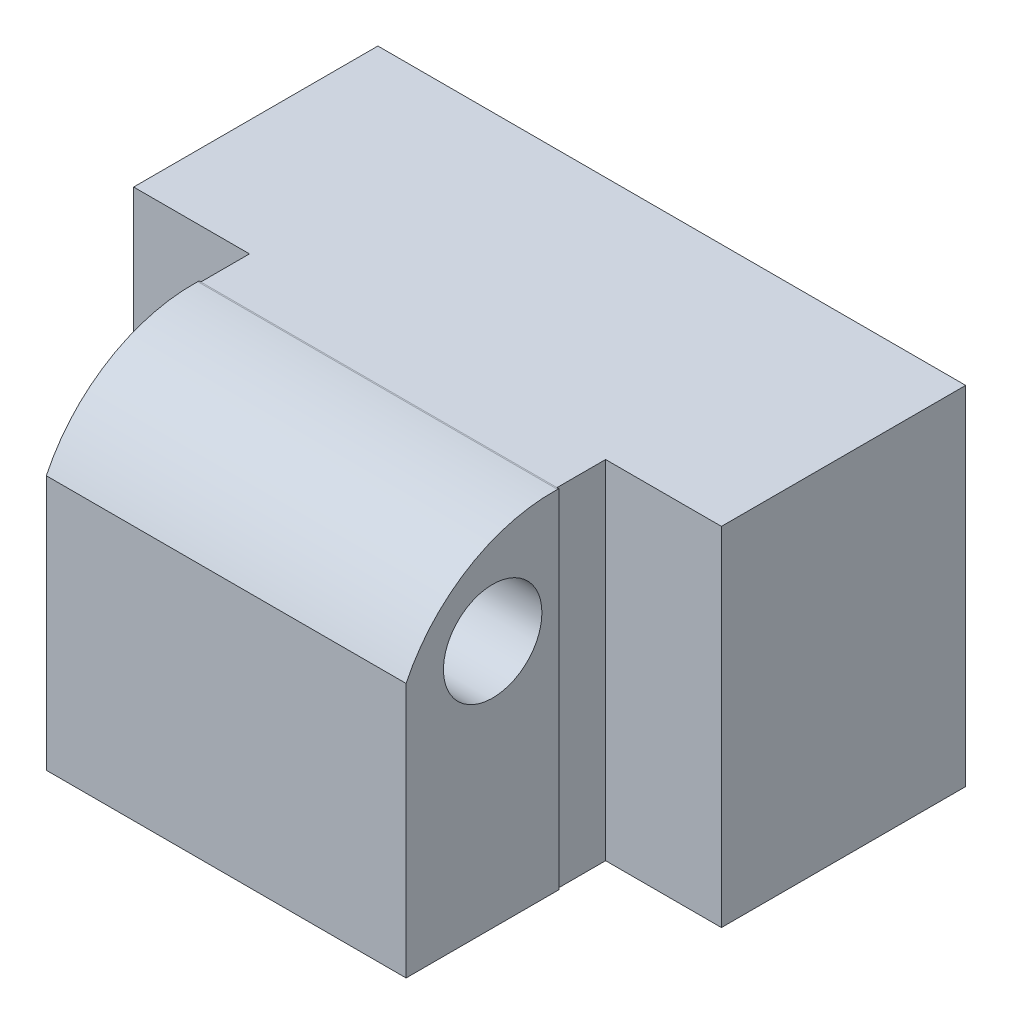
ISO-10303-21;
HEADER;
FILE_DESCRIPTION(('STEP AP214'),'2;1');
FILE_NAME('part.step','',(''),(''),'','','');
FILE_SCHEMA(('AUTOMOTIVE_DESIGN { 1 0 10303 214 1 1 1 1 }'));
ENDSEC;
DATA;
#1=APPLICATION_CONTEXT('core data for automotive mechanical design processes');
#2=APPLICATION_PROTOCOL_DEFINITION('international standard','automotive_design',2000,#1);
#3=PRODUCT_CONTEXT('',#1,'mechanical');
#4=PRODUCT('Part','Part','',(#3));
#5=PRODUCT_RELATED_PRODUCT_CATEGORY('part','',(#4));
#6=PRODUCT_DEFINITION_FORMATION('','',#4);
#7=PRODUCT_DEFINITION_CONTEXT('part definition',#1,'design');
#8=PRODUCT_DEFINITION('design','',#6,#7);
#9=PRODUCT_DEFINITION_SHAPE('','',#8);
#10=(LENGTH_UNIT() NAMED_UNIT(*) SI_UNIT(.MILLI.,.METRE.));
#11=(NAMED_UNIT(*) PLANE_ANGLE_UNIT() SI_UNIT($,.RADIAN.));
#12=(NAMED_UNIT(*) SI_UNIT($,.STERADIAN.) SOLID_ANGLE_UNIT());
#13=UNCERTAINTY_MEASURE_WITH_UNIT(LENGTH_MEASURE(1.E-05),#10,'distance_accuracy_value','');
#14=(GEOMETRIC_REPRESENTATION_CONTEXT(3) GLOBAL_UNCERTAINTY_ASSIGNED_CONTEXT((#13)) GLOBAL_UNIT_ASSIGNED_CONTEXT((#10,
#11,#12)) REPRESENTATION_CONTEXT('',''));
#15=CARTESIAN_POINT('',(0.,0.,0.));
#16=DIRECTION('',(0.,0.,1.));
#17=DIRECTION('',(1.,0.,0.));
#18=AXIS2_PLACEMENT_3D('',#15,#16,#17);
#19=CARTESIAN_POINT('',(-10.15,12.,65.2544271440087));
#20=DIRECTION('',(1.,0.,0.));
#21=DIRECTION('',(0.,0.,-1.));
#22=AXIS2_PLACEMENT_3D('',#19,#20,#21);
#23=PLANE('',#22);
#24=DIRECTION('',(0.,0.,1.));
#25=VECTOR('',#24,1.);
#26=CARTESIAN_POINT('',(-10.15,0.,65.2544271440087));
#27=LINE('',#26,#25);
#28=CARTESIAN_POINT('',(-10.15,0.,56.819346079043));
#29=VERTEX_POINT('',#28);
#30=CARTESIAN_POINT('',(-10.15,0.,65.2544271440087));
#31=VERTEX_POINT('',#30);
#32=EDGE_CURVE('E142',#29,#31,#27,.T.);
#33=ORIENTED_EDGE('',*,*,#32,.T.);
#34=DIRECTION('',(0.,-1.,0.));
#35=VECTOR('',#34,1.);
#36=CARTESIAN_POINT('',(-10.15,12.,65.2544271440087));
#37=LINE('',#36,#35);
#38=CARTESIAN_POINT('',(-10.15,12.,65.2544271440087));
#39=VERTEX_POINT('',#38);
#40=EDGE_CURVE('E11',#39,#31,#37,.T.);
#41=ORIENTED_EDGE('',*,*,#40,.F.);
#42=DIRECTION('',(0.,0.,1.));
#43=VECTOR('',#42,1.);
#44=CARTESIAN_POINT('',(-10.15,12.,65.2544271440087));
#45=LINE('',#44,#43);
#46=CARTESIAN_POINT('',(-10.15,12.,56.819346079043));
#47=VERTEX_POINT('',#46);
#48=EDGE_CURVE('E163',#47,#39,#45,.T.);
#49=ORIENTED_EDGE('',*,*,#48,.F.);
#50=DIRECTION('',(0.,-1.,0.));
#51=VECTOR('',#50,1.);
#52=CARTESIAN_POINT('',(-10.15,12.,56.819346079043));
#53=LINE('',#52,#51);
#54=EDGE_CURVE('E138',#47,#29,#53,.T.);
#55=ORIENTED_EDGE('',*,*,#54,.T.);
#56=EDGE_LOOP('',(#33,#41,#49,#55));
#57=FACE_BOUND('',#56,.T.);
#58=ADVANCED_FACE('F41',(#57),#23,.F.);
#59=CARTESIAN_POINT('',(-6.15,12.,65.2544271440087));
#60=DIRECTION('',(0.,0.,-1.));
#61=DIRECTION('',(-1.,0.,0.));
#62=AXIS2_PLACEMENT_3D('',#59,#60,#61);
#63=PLANE('',#62);
#64=DIRECTION('',(1.,0.,0.));
#65=VECTOR('',#64,1.);
#66=CARTESIAN_POINT('',(-6.15,0.,65.2544271440087));
#67=LINE('',#66,#65);
#68=CARTESIAN_POINT('',(-6.15,0.,65.2544271440087));
#69=VERTEX_POINT('',#68);
#70=EDGE_CURVE('E146',#31,#69,#67,.T.);
#71=ORIENTED_EDGE('',*,*,#70,.T.);
#72=DIRECTION('',(0.,-1.,0.));
#73=VECTOR('',#72,1.);
#74=CARTESIAN_POINT('',(-6.15,12.,65.2544271440087));
#75=LINE('',#74,#73);
#76=CARTESIAN_POINT('',(-6.15,12.,65.2544271440087));
#77=VERTEX_POINT('',#76);
#78=EDGE_CURVE('E50',#77,#69,#75,.T.);
#79=ORIENTED_EDGE('',*,*,#78,.F.);
#80=DIRECTION('',(1.,0.,0.));
#81=VECTOR('',#80,1.);
#82=CARTESIAN_POINT('',(-6.15,12.,65.2544271440087));
#83=LINE('',#82,#81);
#84=EDGE_CURVE('E99',#39,#77,#83,.T.);
#85=ORIENTED_EDGE('',*,*,#84,.F.);
#86=ORIENTED_EDGE('',*,*,#40,.T.);
#87=EDGE_LOOP('',(#71,#79,#85,#86));
#88=FACE_BOUND('',#87,.T.);
#89=ADVANCED_FACE('F341',(#88),#63,.F.);
#90=CARTESIAN_POINT('',(-6.15,12.,66.9344271440087));
#91=DIRECTION('',(1.,0.,0.));
#92=DIRECTION('',(0.,0.,-1.));
#93=AXIS2_PLACEMENT_3D('',#90,#91,#92);
#94=PLANE('',#93);
#95=DIRECTION('',(0.,0.,1.));
#96=VECTOR('',#95,1.);
#97=CARTESIAN_POINT('',(-6.15,0.,66.9344271440087));
#98=LINE('',#97,#96);
#99=CARTESIAN_POINT('',(-6.15,0.,66.9344271440087));
#100=VERTEX_POINT('',#99);
#101=EDGE_CURVE('E150',#69,#100,#98,.T.);
#102=ORIENTED_EDGE('',*,*,#101,.T.);
#103=DIRECTION('',(0.,-1.,0.));
#104=VECTOR('',#103,1.);
#105=CARTESIAN_POINT('',(-6.15,12.,66.9344271440087));
#106=LINE('',#105,#104);
#107=CARTESIAN_POINT('',(-6.15,12.,66.9344271440087));
#108=VERTEX_POINT('',#107);
#109=EDGE_CURVE('E173',#108,#100,#106,.T.);
#110=ORIENTED_EDGE('',*,*,#109,.F.);
#111=DIRECTION('',(0.,0.,1.));
#112=VECTOR('',#111,1.);
#113=CARTESIAN_POINT('',(-6.15,12.,66.9344271440087));
#114=LINE('',#113,#112);
#115=EDGE_CURVE('E183',#77,#108,#114,.T.);
#116=ORIENTED_EDGE('',*,*,#115,.F.);
#117=ORIENTED_EDGE('',*,*,#78,.T.);
#118=EDGE_LOOP('',(#102,#110,#116,#117));
#119=FACE_BOUND('',#118,.T.);
#120=ADVANCED_FACE('F181',(#119),#94,.F.);
#121=CARTESIAN_POINT('',(6.15000000000001,12.,65.2544271440087));
#122=DIRECTION('',(-1.,0.,0.));
#123=DIRECTION('',(0.,0.,1.));
#124=AXIS2_PLACEMENT_3D('',#121,#122,#123);
#125=PLANE('',#124);
#126=DIRECTION('',(0.,0.,-1.));
#127=VECTOR('',#126,1.);
#128=CARTESIAN_POINT('',(6.15000000000001,0.,65.2544271440087));
#129=LINE('',#128,#127);
#130=CARTESIAN_POINT('',(6.15000000000001,0.,66.9344271440087));
#131=VERTEX_POINT('',#130);
#132=CARTESIAN_POINT('',(6.15000000000001,0.,65.2544271440087));
#133=VERTEX_POINT('',#132);
#134=EDGE_CURVE('E154',#131,#133,#129,.T.);
#135=ORIENTED_EDGE('',*,*,#134,.T.);
#136=DIRECTION('',(0.,-1.,0.));
#137=VECTOR('',#136,1.);
#138=CARTESIAN_POINT('',(6.15000000000001,12.,65.2544271440087));
#139=LINE('',#138,#137);
#140=CARTESIAN_POINT('',(6.15000000000001,12.,65.2544271440087));
#141=VERTEX_POINT('',#140);
#142=EDGE_CURVE('E131',#141,#133,#139,.T.);
#143=ORIENTED_EDGE('',*,*,#142,.F.);
#144=DIRECTION('',(0.,0.,-1.));
#145=VECTOR('',#144,1.);
#146=CARTESIAN_POINT('',(6.15000000000001,12.,65.2544271440087));
#147=LINE('',#146,#145);
#148=CARTESIAN_POINT('',(6.15000000000001,12.,66.9344271440087));
#149=VERTEX_POINT('',#148);
#150=EDGE_CURVE('E120',#149,#141,#147,.T.);
#151=ORIENTED_EDGE('',*,*,#150,.F.);
#152=DIRECTION('',(0.,-1.,0.));
#153=VECTOR('',#152,1.);
#154=CARTESIAN_POINT('',(6.15000000000001,12.,66.9344271440087));
#155=LINE('',#154,#153);
#156=EDGE_CURVE('E170',#149,#131,#155,.T.);
#157=ORIENTED_EDGE('',*,*,#156,.T.);
#158=EDGE_LOOP('',(#135,#143,#151,#157));
#159=FACE_BOUND('',#158,.T.);
#160=ADVANCED_FACE('F227',(#159),#125,.F.);
#161=CARTESIAN_POINT('',(10.15,12.,65.2544271440087));
#162=DIRECTION('',(0.,0.,-1.));
#163=DIRECTION('',(-1.,0.,0.));
#164=AXIS2_PLACEMENT_3D('',#161,#162,#163);
#165=PLANE('',#164);
#166=DIRECTION('',(1.,0.,0.));
#167=VECTOR('',#166,1.);
#168=CARTESIAN_POINT('',(10.15,0.,65.2544271440087));
#169=LINE('',#168,#167);
#170=CARTESIAN_POINT('',(10.15,0.,65.2544271440087));
#171=VERTEX_POINT('',#170);
#172=EDGE_CURVE('E129',#133,#171,#169,.T.);
#173=ORIENTED_EDGE('',*,*,#172,.T.);
#174=DIRECTION('',(0.,-1.,0.));
#175=VECTOR('',#174,1.);
#176=CARTESIAN_POINT('',(10.15,12.,65.2544271440087));
#177=LINE('',#176,#175);
#178=CARTESIAN_POINT('',(10.15,12.,65.2544271440087));
#179=VERTEX_POINT('',#178);
#180=EDGE_CURVE('E126',#179,#171,#177,.T.);
#181=ORIENTED_EDGE('',*,*,#180,.F.);
#182=DIRECTION('',(1.,0.,0.));
#183=VECTOR('',#182,1.);
#184=CARTESIAN_POINT('',(10.15,12.,65.2544271440087));
#185=LINE('',#184,#183);
#186=EDGE_CURVE('E114',#141,#179,#185,.T.);
#187=ORIENTED_EDGE('',*,*,#186,.F.);
#188=ORIENTED_EDGE('',*,*,#142,.T.);
#189=EDGE_LOOP('',(#173,#181,#187,#188));
#190=FACE_BOUND('',#189,.T.);
#191=ADVANCED_FACE('F127',(#190),#165,.F.);
#192=CARTESIAN_POINT('',(10.15,12.,65.2544271440087));
#193=DIRECTION('',(-1.,0.,0.));
#194=DIRECTION('',(0.,0.,1.));
#195=AXIS2_PLACEMENT_3D('',#192,#193,#194);
#196=PLANE('',#195);
#197=DIRECTION('',(0.,0.,-1.));
#198=VECTOR('',#197,1.);
#199=CARTESIAN_POINT('',(10.15,0.,65.2544271440087));
#200=LINE('',#199,#198);
#201=CARTESIAN_POINT('',(10.15,0.,56.819346079043));
#202=VERTEX_POINT('',#201);
#203=EDGE_CURVE('E85',#171,#202,#200,.T.);
#204=ORIENTED_EDGE('',*,*,#203,.T.);
#205=DIRECTION('',(0.,-1.,0.));
#206=VECTOR('',#205,1.);
#207=CARTESIAN_POINT('',(10.15,12.,56.819346079043));
#208=LINE('',#207,#206);
#209=CARTESIAN_POINT('',(10.15,12.,56.819346079043));
#210=VERTEX_POINT('',#209);
#211=EDGE_CURVE('E132',#210,#202,#208,.T.);
#212=ORIENTED_EDGE('',*,*,#211,.F.);
#213=DIRECTION('',(0.,0.,-1.));
#214=VECTOR('',#213,1.);
#215=CARTESIAN_POINT('',(10.15,12.,65.2544271440087));
#216=LINE('',#215,#214);
#217=EDGE_CURVE('E118',#179,#210,#216,.T.);
#218=ORIENTED_EDGE('',*,*,#217,.F.);
#219=ORIENTED_EDGE('',*,*,#180,.T.);
#220=EDGE_LOOP('',(#204,#212,#218,#219));
#221=FACE_BOUND('',#220,.T.);
#222=ADVANCED_FACE('F134',(#221),#196,.F.);
#223=CARTESIAN_POINT('',(-10.15,12.,56.819346079043));
#224=DIRECTION('',(0.,0.,1.));
#225=DIRECTION('',(1.,0.,0.));
#226=AXIS2_PLACEMENT_3D('',#223,#224,#225);
#227=PLANE('',#226);
#228=DIRECTION('',(-1.,0.,0.));
#229=VECTOR('',#228,1.);
#230=CARTESIAN_POINT('',(-10.15,0.,56.819346079043));
#231=LINE('',#230,#229);
#232=EDGE_CURVE('E91',#202,#29,#231,.T.);
#233=ORIENTED_EDGE('',*,*,#232,.T.);
#234=ORIENTED_EDGE('',*,*,#54,.F.);
#235=DIRECTION('',(-1.,0.,0.));
#236=VECTOR('',#235,1.);
#237=CARTESIAN_POINT('',(-10.15,12.,56.819346079043));
#238=LINE('',#237,#236);
#239=EDGE_CURVE('E58',#210,#47,#238,.T.);
#240=ORIENTED_EDGE('',*,*,#239,.F.);
#241=ORIENTED_EDGE('',*,*,#211,.T.);
#242=EDGE_LOOP('',(#233,#234,#240,#241));
#243=FACE_BOUND('',#242,.T.);
#244=ADVANCED_FACE('F348',(#243),#227,.F.);
#245=CARTESIAN_POINT('',(0.,12.,0.));
#246=DIRECTION('',(0.,-1.,0.));
#247=DIRECTION('',(0.,0.,-1.));
#248=AXIS2_PLACEMENT_3D('',#245,#246,#247);
#249=PLANE('',#248);
#250=ORIENTED_EDGE('',*,*,#48,.T.);
#251=ORIENTED_EDGE('',*,*,#84,.T.);
#252=ORIENTED_EDGE('',*,*,#115,.T.);
#253=DIRECTION('',(1.,0.,0.));
#254=VECTOR('',#253,1.);
#255=CARTESIAN_POINT('',(6.15000000000001,12.,66.9344271440087));
#256=LINE('',#255,#254);
#257=EDGE_CURVE('E219',#108,#149,#256,.T.);
#258=ORIENTED_EDGE('',*,*,#257,.T.);
#259=ORIENTED_EDGE('',*,*,#150,.T.);
#260=ORIENTED_EDGE('',*,*,#186,.T.);
#261=ORIENTED_EDGE('',*,*,#217,.T.);
#262=ORIENTED_EDGE('',*,*,#239,.T.);
#263=EDGE_LOOP('',(#250,#251,#252,#258,#259,#260,#261,#262));
#264=FACE_BOUND('',#263,.T.);
#265=ADVANCED_FACE('F116',(#264),#249,.F.);
#266=CARTESIAN_POINT('',(0.,0.,0.));
#267=DIRECTION('',(0.,-1.,0.));
#268=DIRECTION('',(0.,0.,-1.));
#269=AXIS2_PLACEMENT_3D('',#266,#267,#268);
#270=PLANE('',#269);
#271=ORIENTED_EDGE('',*,*,#32,.F.);
#272=ORIENTED_EDGE('',*,*,#232,.F.);
#273=ORIENTED_EDGE('',*,*,#203,.F.);
#274=ORIENTED_EDGE('',*,*,#172,.F.);
#275=ORIENTED_EDGE('',*,*,#134,.F.);
#276=DIRECTION('',(-1.,0.,0.));
#277=VECTOR('',#276,1.);
#278=CARTESIAN_POINT('',(6.2125,0.,66.9344271440087));
#279=LINE('',#278,#277);
#280=CARTESIAN_POINT('',(6.2125,0.,66.9344271440087));
#281=VERTEX_POINT('',#280);
#282=EDGE_CURVE('E200',#281,#131,#279,.T.);
#283=ORIENTED_EDGE('',*,*,#282,.F.);
#284=DIRECTION('',(0.,0.,-1.));
#285=VECTOR('',#284,1.);
#286=CARTESIAN_POINT('',(6.2125,0.,66.9344271440087));
#287=LINE('',#286,#285);
#288=CARTESIAN_POINT('',(6.2125,0.,72.2072929333866));
#289=VERTEX_POINT('',#288);
#290=EDGE_CURVE('E258',#289,#281,#287,.T.);
#291=ORIENTED_EDGE('',*,*,#290,.F.);
#292=DIRECTION('',(-1.,0.,0.));
#293=VECTOR('',#292,1.);
#294=CARTESIAN_POINT('',(6.2125,0.,72.2072929333866));
#295=LINE('',#294,#293);
#296=CARTESIAN_POINT('',(-6.2125,0.,72.2072929333866));
#297=VERTEX_POINT('',#296);
#298=EDGE_CURVE('E147',#289,#297,#295,.T.);
#299=ORIENTED_EDGE('',*,*,#298,.T.);
#300=DIRECTION('',(0.,0.,-1.));
#301=VECTOR('',#300,1.);
#302=CARTESIAN_POINT('',(-6.2125,0.,66.9344271440087));
#303=LINE('',#302,#301);
#304=CARTESIAN_POINT('',(-6.2125,0.,66.9344271440087));
#305=VERTEX_POINT('',#304);
#306=EDGE_CURVE('E194',#297,#305,#303,.T.);
#307=ORIENTED_EDGE('',*,*,#306,.T.);
#308=EDGE_CURVE('E190',#100,#305,#279,.T.);
#309=ORIENTED_EDGE('',*,*,#308,.F.);
#310=ORIENTED_EDGE('',*,*,#101,.F.);
#311=ORIENTED_EDGE('',*,*,#70,.F.);
#312=EDGE_LOOP('',(#271,#272,#273,#274,#275,#283,#291,#299,#307,#309,#310,#311));
#313=FACE_BOUND('',#312,.T.);
#314=ADVANCED_FACE('F187',(#313),#270,.T.);
#315=CARTESIAN_POINT('',(6.2125,12.,66.9344271440087));
#316=DIRECTION('',(0.,0.,1.));
#317=DIRECTION('',(1.,0.,0.));
#318=AXIS2_PLACEMENT_3D('',#315,#316,#317);
#319=PLANE('',#318);
#320=DIRECTION('',(-1.,0.,0.));
#321=VECTOR('',#320,1.);
#322=CARTESIAN_POINT('',(6.2125,12.,66.9344271440087));
#323=LINE('',#322,#321);
#324=CARTESIAN_POINT('',(-6.2125,12.,66.9344271440087));
#325=VERTEX_POINT('',#324);
#326=EDGE_CURVE('E207',#108,#325,#323,.T.);
#327=ORIENTED_EDGE('',*,*,#326,.F.);
#328=ORIENTED_EDGE('',*,*,#109,.T.);
#329=ORIENTED_EDGE('',*,*,#308,.T.);
#330=DIRECTION('',(0.,1.,0.));
#331=VECTOR('',#330,1.);
#332=CARTESIAN_POINT('',(-6.2125,12.,66.9344271440087));
#333=LINE('',#332,#331);
#334=EDGE_CURVE('E264',#305,#325,#333,.T.);
#335=ORIENTED_EDGE('',*,*,#334,.T.);
#336=EDGE_LOOP('',(#327,#328,#329,#335));
#337=FACE_BOUND('',#336,.T.);
#338=ADVANCED_FACE('F291',(#337),#319,.F.);
#339=CARTESIAN_POINT('',(6.2125,6.38787348437044,67.1422804754121));
#340=DIRECTION('',(1.,0.,0.));
#341=DIRECTION('',(0.,0.,-1.));
#342=AXIS2_PLACEMENT_3D('',#339,#340,#341);
#343=PLANE('',#342);
#344=DIRECTION('',(0.,-1.,0.));
#345=VECTOR('',#344,1.);
#346=CARTESIAN_POINT('',(6.2125,0.,72.2072929333866));
#347=LINE('',#346,#345);
#348=CARTESIAN_POINT('',(6.2125,8.80966506907478,72.2072929333866));
#349=VERTEX_POINT('',#348);
#350=EDGE_CURVE('E279',#349,#289,#347,.T.);
#351=ORIENTED_EDGE('',*,*,#350,.T.);
#352=ORIENTED_EDGE('',*,*,#290,.T.);
#353=DIRECTION('',(0.,1.,0.));
#354=VECTOR('',#353,1.);
#355=CARTESIAN_POINT('',(6.2125,12.,66.9344271440087));
#356=LINE('',#355,#354);
#357=CARTESIAN_POINT('',(6.2125,12.,66.9344271440087));
#358=VERTEX_POINT('',#357);
#359=EDGE_CURVE('E252',#281,#358,#356,.T.);
#360=ORIENTED_EDGE('',*,*,#359,.T.);
#361=DIRECTION('',(0.,-0.00781324003835743,0.999969476174199));
#362=VECTOR('',#361,1.);
#363=CARTESIAN_POINT('',(6.2125,11.9996650690748,66.9772929333866));
#364=LINE('',#363,#362);
#365=CARTESIAN_POINT('',(6.2125,11.9996650690748,66.9772929333866));
#366=VERTEX_POINT('',#365);
#367=EDGE_CURVE('E240',#358,#366,#364,.T.);
#368=ORIENTED_EDGE('',*,*,#367,.T.);
#369=CARTESIAN_POINT('',(6.2125,6.38787348437044,67.1422804754121));
#370=DIRECTION('',(1.,0.,0.));
#371=DIRECTION('',(0.,0.,-1.));
#372=AXIS2_PLACEMENT_3D('',#369,#370,#371);
#373=CIRCLE('',#372,5.61421639048425);
#374=EDGE_CURVE('E251',#366,#349,#373,.T.);
#375=ORIENTED_EDGE('',*,*,#374,.T.);
#376=EDGE_LOOP('',(#351,#352,#360,#368,#375));
#377=FACE_BOUND('',#376,.T.);
#378=CARTESIAN_POINT('',(6.2125,8.57966506907478,69.2172929333866));
#379=DIRECTION('',(1.,0.,0.));
#380=DIRECTION('',(0.,0.,-1.));
#381=AXIS2_PLACEMENT_3D('',#378,#379,#380);
#382=CIRCLE('',#381,1.7);
#383=CARTESIAN_POINT('',(6.2125,8.57966506907478,67.5172929333867));
#384=VERTEX_POINT('',#383);
#385=EDGE_CURVE('E265',#384,#384,#382,.T.);
#386=ORIENTED_EDGE('',*,*,#385,.F.);
#387=EDGE_LOOP('',(#386));
#388=FACE_BOUND('',#387,.T.);
#389=ADVANCED_FACE('F311',(#377,#388),#343,.T.);
#390=CARTESIAN_POINT('',(-6.2125,6.38787348437044,67.1422804754121));
#391=DIRECTION('',(1.,0.,0.));
#392=DIRECTION('',(0.,0.,-1.));
#393=AXIS2_PLACEMENT_3D('',#390,#391,#392);
#394=PLANE('',#393);
#395=ORIENTED_EDGE('',*,*,#306,.F.);
#396=DIRECTION('',(0.,-1.,0.));
#397=VECTOR('',#396,1.);
#398=CARTESIAN_POINT('',(-6.2125,5.99966506907478,72.2072929333866));
#399=LINE('',#398,#397);
#400=CARTESIAN_POINT('',(-6.2125,8.80966506907478,72.2072929333866));
#401=VERTEX_POINT('',#400);
#402=EDGE_CURVE('E275',#401,#297,#399,.T.);
#403=ORIENTED_EDGE('',*,*,#402,.F.);
#404=CARTESIAN_POINT('',(-6.2125,6.38787348437044,67.1422804754121));
#405=DIRECTION('',(1.,0.,0.));
#406=DIRECTION('',(0.,0.,-1.));
#407=AXIS2_PLACEMENT_3D('',#404,#405,#406);
#408=CIRCLE('',#407,5.61421639048425);
#409=CARTESIAN_POINT('',(-6.2125,11.9996650690748,66.9772929333866));
#410=VERTEX_POINT('',#409);
#411=EDGE_CURVE('E271',#410,#401,#408,.T.);
#412=ORIENTED_EDGE('',*,*,#411,.F.);
#413=DIRECTION('',(0.,-0.00781324003835743,0.999969476174199));
#414=VECTOR('',#413,1.);
#415=CARTESIAN_POINT('',(-6.2125,11.9996650690748,66.9772929333866));
#416=LINE('',#415,#414);
#417=EDGE_CURVE('E268',#325,#410,#416,.T.);
#418=ORIENTED_EDGE('',*,*,#417,.F.);
#419=ORIENTED_EDGE('',*,*,#334,.F.);
#420=EDGE_LOOP('',(#395,#403,#412,#418,#419));
#421=FACE_BOUND('',#420,.T.);
#422=CARTESIAN_POINT('',(-6.2125,8.57966506907478,69.2172929333866));
#423=DIRECTION('',(1.,0.,0.));
#424=DIRECTION('',(0.,0.,-1.));
#425=AXIS2_PLACEMENT_3D('',#422,#423,#424);
#426=CIRCLE('',#425,1.7);
#427=CARTESIAN_POINT('',(-6.2125,8.57966506907478,67.5172929333867));
#428=VERTEX_POINT('',#427);
#429=EDGE_CURVE('E321',#428,#428,#426,.T.);
#430=ORIENTED_EDGE('',*,*,#429,.T.);
#431=EDGE_LOOP('',(#430));
#432=FACE_BOUND('',#431,.T.);
#433=ADVANCED_FACE('F293',(#421,#432),#394,.F.);
#434=ORIENTED_EDGE('',*,*,#156,.F.);
#435=EDGE_CURVE('E201',#358,#149,#323,.T.);
#436=ORIENTED_EDGE('',*,*,#435,.F.);
#437=ORIENTED_EDGE('',*,*,#359,.F.);
#438=ORIENTED_EDGE('',*,*,#282,.T.);
#439=EDGE_LOOP('',(#434,#436,#437,#438));
#440=FACE_BOUND('',#439,.T.);
#441=ADVANCED_FACE('F231',(#440),#319,.F.);
#442=CARTESIAN_POINT('',(6.2125,11.9996650690748,66.9772929333866));
#443=DIRECTION('',(0.,-0.9999694761742,-0.00781324003835744));
#444=DIRECTION('',(0.,0.00781324003835744,-0.9999694761742));
#445=AXIS2_PLACEMENT_3D('',#442,#443,#444);
#446=PLANE('',#445);
#447=ORIENTED_EDGE('',*,*,#417,.T.);
#448=DIRECTION('',(-1.,0.,0.));
#449=VECTOR('',#448,1.);
#450=CARTESIAN_POINT('',(6.2125,11.9996650690748,66.9772929333866));
#451=LINE('',#450,#449);
#452=EDGE_CURVE('E243',#366,#410,#451,.T.);
#453=ORIENTED_EDGE('',*,*,#452,.F.);
#454=ORIENTED_EDGE('',*,*,#367,.F.);
#455=ORIENTED_EDGE('',*,*,#435,.T.);
#456=ORIENTED_EDGE('',*,*,#257,.F.);
#457=ORIENTED_EDGE('',*,*,#326,.T.);
#458=EDGE_LOOP('',(#447,#453,#454,#455,#456,#457));
#459=FACE_BOUND('',#458,.T.);
#460=ADVANCED_FACE('F237',(#459),#446,.F.);
#461=CARTESIAN_POINT('',(6.2125,6.38787348437044,67.1422804754121));
#462=DIRECTION('',(-1.,0.,0.));
#463=DIRECTION('',(0.,0.,1.));
#464=AXIS2_PLACEMENT_3D('',#461,#462,#463);
#465=CYLINDRICAL_SURFACE('',#464,5.61421639048425);
#466=ORIENTED_EDGE('',*,*,#411,.T.);
#467=DIRECTION('',(-1.,0.,0.));
#468=VECTOR('',#467,1.);
#469=CARTESIAN_POINT('',(6.2125,8.80966506907478,72.2072929333866));
#470=LINE('',#469,#468);
#471=EDGE_CURVE('E256',#349,#401,#470,.T.);
#472=ORIENTED_EDGE('',*,*,#471,.F.);
#473=ORIENTED_EDGE('',*,*,#374,.F.);
#474=ORIENTED_EDGE('',*,*,#452,.T.);
#475=EDGE_LOOP('',(#466,#472,#473,#474));
#476=FACE_BOUND('',#475,.T.);
#477=ADVANCED_FACE('F299',(#476),#465,.T.);
#478=CARTESIAN_POINT('',(6.2125,5.99966506907478,72.2072929333866));
#479=DIRECTION('',(0.,0.,-1.));
#480=DIRECTION('',(-1.,0.,0.));
#481=AXIS2_PLACEMENT_3D('',#478,#479,#480);
#482=PLANE('',#481);
#483=ORIENTED_EDGE('',*,*,#402,.T.);
#484=ORIENTED_EDGE('',*,*,#298,.F.);
#485=ORIENTED_EDGE('',*,*,#350,.F.);
#486=ORIENTED_EDGE('',*,*,#471,.T.);
#487=EDGE_LOOP('',(#483,#484,#485,#486));
#488=FACE_BOUND('',#487,.T.);
#489=ADVANCED_FACE('F303',(#488),#482,.F.);
#490=CARTESIAN_POINT('',(6.2125,8.57966506907478,69.2172929333866));
#491=DIRECTION('',(-1.,0.,0.));
#492=DIRECTION('',(0.,0.,1.));
#493=AXIS2_PLACEMENT_3D('',#490,#491,#492);
#494=CYLINDRICAL_SURFACE('',#493,1.7);
#495=ORIENTED_EDGE('',*,*,#385,.T.);
#496=EDGE_LOOP('',(#495));
#497=FACE_BOUND('',#496,.T.);
#498=ORIENTED_EDGE('',*,*,#429,.F.);
#499=EDGE_LOOP('',(#498));
#500=FACE_BOUND('',#499,.T.);
#501=ADVANCED_FACE('F329',(#497,#500),#494,.F.);
#502=CLOSED_SHELL('',(#58,#89,#120,#160,#191,#222,#244,#265,#314,#338,#389,#433,#441,#460,#477,
#489,#501));
#503=MANIFOLD_SOLID_BREP('B2',#502);
#504=ADVANCED_BREP_SHAPE_REPRESENTATION('',(#18,#503),#14);
#505=SHAPE_DEFINITION_REPRESENTATION(#9,#504);
ENDSEC;
END-ISO-10303-21;
